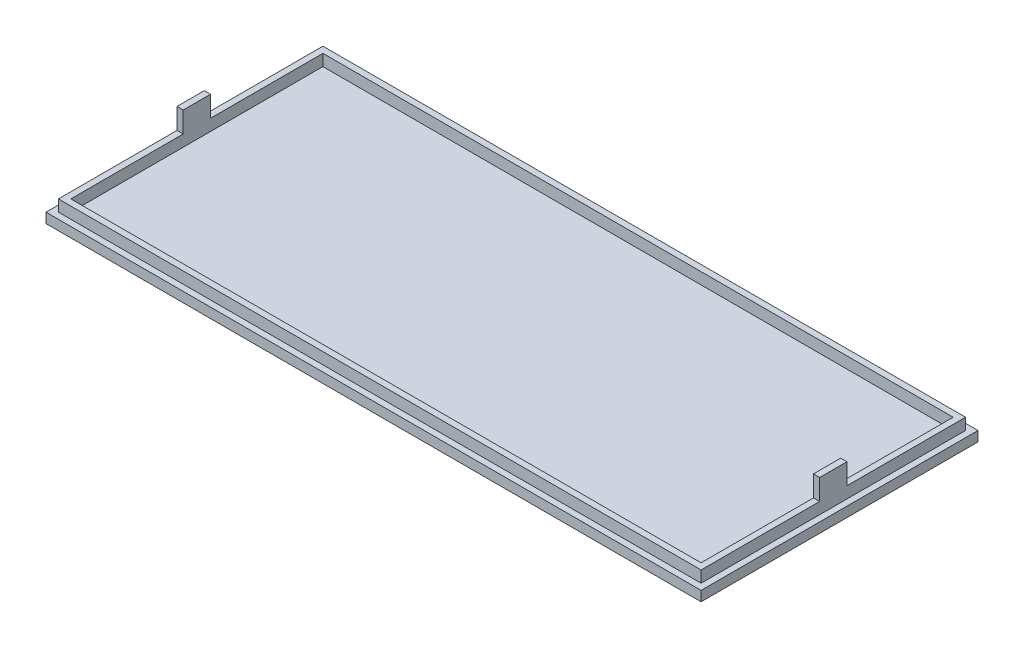
ISO-10303-21;
HEADER;
FILE_DESCRIPTION(('STEP AP214'),'2;1');
FILE_NAME('part.step','',(''),(''),'','','');
FILE_SCHEMA(('AUTOMOTIVE_DESIGN { 1 0 10303 214 1 1 1 1 }'));
ENDSEC;
DATA;
#1=APPLICATION_CONTEXT('core data for automotive mechanical design processes');
#2=APPLICATION_PROTOCOL_DEFINITION('international standard','automotive_design',2000,#1);
#3=PRODUCT_CONTEXT('',#1,'mechanical');
#4=PRODUCT('Part','Part','',(#3));
#5=PRODUCT_RELATED_PRODUCT_CATEGORY('part','',(#4));
#6=PRODUCT_DEFINITION_FORMATION('','',#4);
#7=PRODUCT_DEFINITION_CONTEXT('part definition',#1,'design');
#8=PRODUCT_DEFINITION('design','',#6,#7);
#9=PRODUCT_DEFINITION_SHAPE('','',#8);
#10=(LENGTH_UNIT() NAMED_UNIT(*) SI_UNIT(.MILLI.,.METRE.));
#11=(NAMED_UNIT(*) PLANE_ANGLE_UNIT() SI_UNIT($,.RADIAN.));
#12=(NAMED_UNIT(*) SI_UNIT($,.STERADIAN.) SOLID_ANGLE_UNIT());
#13=UNCERTAINTY_MEASURE_WITH_UNIT(LENGTH_MEASURE(1.E-05),#10,'distance_accuracy_value','');
#14=(GEOMETRIC_REPRESENTATION_CONTEXT(3) GLOBAL_UNCERTAINTY_ASSIGNED_CONTEXT((#13)) GLOBAL_UNIT_ASSIGNED_CONTEXT((#10,
#11,#12)) REPRESENTATION_CONTEXT('',''));
#15=CARTESIAN_POINT('',(0.,0.,0.));
#16=DIRECTION('',(0.,0.,1.));
#17=DIRECTION('',(1.,0.,0.));
#18=AXIS2_PLACEMENT_3D('',#15,#16,#17);
#19=CARTESIAN_POINT('',(0.,3.45,0.));
#20=DIRECTION('',(0.,1.,0.));
#21=DIRECTION('',(0.,0.,1.));
#22=AXIS2_PLACEMENT_3D('',#19,#20,#21);
#23=PLANE('',#22);
#24=DIRECTION('',(0.,0.,1.));
#25=VECTOR('',#24,1.);
#26=CARTESIAN_POINT('',(-26.9,3.45,0.));
#27=LINE('',#26,#25);
#28=CARTESIAN_POINT('',(-26.9,3.45,10.1454347826087));
#29=VERTEX_POINT('',#28);
#30=CARTESIAN_POINT('',(-26.9,3.45,28.2654347826087));
#31=VERTEX_POINT('',#30);
#32=EDGE_CURVE('E51',#29,#31,#27,.T.);
#33=ORIENTED_EDGE('',*,*,#32,.F.);
#34=DIRECTION('',(-1.,0.,0.));
#35=VECTOR('',#34,1.);
#36=CARTESIAN_POINT('',(0.,3.45,10.1454347826087));
#37=LINE('',#36,#35);
#38=CARTESIAN_POINT('',(-27.9,3.45,10.1454347826087));
#39=VERTEX_POINT('',#38);
#40=EDGE_CURVE('E200',#29,#39,#37,.T.);
#41=ORIENTED_EDGE('',*,*,#40,.T.);
#42=DIRECTION('',(0.,0.,1.));
#43=VECTOR('',#42,1.);
#44=CARTESIAN_POINT('',(-27.9,3.45,0.));
#45=LINE('',#44,#43);
#46=CARTESIAN_POINT('',(-27.9,3.45,29.2654347826087));
#47=VERTEX_POINT('',#46);
#48=EDGE_CURVE('E198',#39,#47,#45,.T.);
#49=ORIENTED_EDGE('',*,*,#48,.T.);
#50=DIRECTION('',(1.,0.,0.));
#51=VECTOR('',#50,1.);
#52=CARTESIAN_POINT('',(0.,3.45,29.2654347826087));
#53=LINE('',#52,#51);
#54=CARTESIAN_POINT('',(75.7,3.45,29.2654347826087));
#55=VERTEX_POINT('',#54);
#56=EDGE_CURVE('E230',#47,#55,#53,.T.);
#57=ORIENTED_EDGE('',*,*,#56,.T.);
#58=DIRECTION('',(0.,0.,1.));
#59=VECTOR('',#58,1.);
#60=CARTESIAN_POINT('',(75.7,3.45,0.));
#61=LINE('',#60,#59);
#62=CARTESIAN_POINT('',(75.7,3.45,10.1454347826087));
#63=VERTEX_POINT('',#62);
#64=EDGE_CURVE('E233',#63,#55,#61,.T.);
#65=ORIENTED_EDGE('',*,*,#64,.F.);
#66=DIRECTION('',(-1.,0.,0.));
#67=VECTOR('',#66,1.);
#68=CARTESIAN_POINT('',(0.,3.45,10.1454347826087));
#69=LINE('',#68,#67);
#70=CARTESIAN_POINT('',(74.7,3.45,10.1454347826087));
#71=VERTEX_POINT('',#70);
#72=EDGE_CURVE('E11',#63,#71,#69,.T.);
#73=ORIENTED_EDGE('',*,*,#72,.T.);
#74=DIRECTION('',(0.,0.,1.));
#75=VECTOR('',#74,1.);
#76=CARTESIAN_POINT('',(74.7,3.45,0.));
#77=LINE('',#76,#75);
#78=CARTESIAN_POINT('',(74.7,3.45,28.2654347826087));
#79=VERTEX_POINT('',#78);
#80=EDGE_CURVE('E242',#71,#79,#77,.T.);
#81=ORIENTED_EDGE('',*,*,#80,.T.);
#82=DIRECTION('',(1.,0.,0.));
#83=VECTOR('',#82,1.);
#84=CARTESIAN_POINT('',(0.,3.45,28.2654347826087));
#85=LINE('',#84,#83);
#86=EDGE_CURVE('E245',#31,#79,#85,.T.);
#87=ORIENTED_EDGE('',*,*,#86,.F.);
#88=EDGE_LOOP('',(#33,#41,#49,#57,#65,#73,#81,#87));
#89=FACE_BOUND('',#88,.T.);
#90=ADVANCED_FACE('F36',(#89),#23,.T.);
#91=DIRECTION('',(-1.,0.,0.));
#92=VECTOR('',#91,1.);
#93=CARTESIAN_POINT('',(0.,3.45,5.74543478260869));
#94=LINE('',#93,#92);
#95=CARTESIAN_POINT('',(-26.9,3.45,5.74543478260869));
#96=VERTEX_POINT('',#95);
#97=CARTESIAN_POINT('',(-27.9,3.45,5.74543478260869));
#98=VERTEX_POINT('',#97);
#99=EDGE_CURVE('E59',#96,#98,#94,.T.);
#100=ORIENTED_EDGE('',*,*,#99,.F.);
#101=CARTESIAN_POINT('',(-26.9,3.45,-12.3745652173913));
#102=VERTEX_POINT('',#101);
#103=EDGE_CURVE('E248',#102,#96,#27,.T.);
#104=ORIENTED_EDGE('',*,*,#103,.F.);
#105=DIRECTION('',(1.,0.,0.));
#106=VECTOR('',#105,1.);
#107=CARTESIAN_POINT('',(0.,3.45,-12.3745652173913));
#108=LINE('',#107,#106);
#109=CARTESIAN_POINT('',(74.7,3.45,-12.3745652173913));
#110=VERTEX_POINT('',#109);
#111=EDGE_CURVE('E250',#102,#110,#108,.T.);
#112=ORIENTED_EDGE('',*,*,#111,.T.);
#113=CARTESIAN_POINT('',(74.7,3.45,5.74543478260869));
#114=VERTEX_POINT('',#113);
#115=EDGE_CURVE('E243',#110,#114,#77,.T.);
#116=ORIENTED_EDGE('',*,*,#115,.T.);
#117=DIRECTION('',(-1.,0.,0.));
#118=VECTOR('',#117,1.);
#119=CARTESIAN_POINT('',(0.,3.45,5.74543478260869));
#120=LINE('',#119,#118);
#121=CARTESIAN_POINT('',(75.7,3.45,5.74543478260869));
#122=VERTEX_POINT('',#121);
#123=EDGE_CURVE('E44',#122,#114,#120,.T.);
#124=ORIENTED_EDGE('',*,*,#123,.F.);
#125=CARTESIAN_POINT('',(75.7,3.45,-13.3745652173913));
#126=VERTEX_POINT('',#125);
#127=EDGE_CURVE('E234',#126,#122,#61,.T.);
#128=ORIENTED_EDGE('',*,*,#127,.F.);
#129=DIRECTION('',(1.,0.,0.));
#130=VECTOR('',#129,1.);
#131=CARTESIAN_POINT('',(0.,3.45,-13.3745652173913));
#132=LINE('',#131,#130);
#133=CARTESIAN_POINT('',(-27.9,3.45,-13.3745652173913));
#134=VERTEX_POINT('',#133);
#135=EDGE_CURVE('E237',#134,#126,#132,.T.);
#136=ORIENTED_EDGE('',*,*,#135,.F.);
#137=EDGE_CURVE('E240',#134,#98,#45,.T.);
#138=ORIENTED_EDGE('',*,*,#137,.T.);
#139=EDGE_LOOP('',(#100,#104,#112,#116,#124,#128,#136,#138));
#140=FACE_BOUND('',#139,.T.);
#141=ADVANCED_FACE('F341',(#140),#23,.T.);
#142=CARTESIAN_POINT('',(0.,1.6,0.));
#143=DIRECTION('',(0.,1.,0.));
#144=DIRECTION('',(0.,0.,1.));
#145=AXIS2_PLACEMENT_3D('',#142,#143,#144);
#146=PLANE('',#145);
#147=DIRECTION('',(0.,0.,1.));
#148=VECTOR('',#147,1.);
#149=CARTESIAN_POINT('',(76.7,1.6,0.));
#150=LINE('',#149,#148);
#151=CARTESIAN_POINT('',(76.7,1.6,-14.3745652173913));
#152=VERTEX_POINT('',#151);
#153=CARTESIAN_POINT('',(76.7,1.6,30.2654347826087));
#154=VERTEX_POINT('',#153);
#155=EDGE_CURVE('E295',#152,#154,#150,.T.);
#156=ORIENTED_EDGE('',*,*,#155,.F.);
#157=DIRECTION('',(1.,0.,0.));
#158=VECTOR('',#157,1.);
#159=CARTESIAN_POINT('',(0.,1.6,-14.3745652173913));
#160=LINE('',#159,#158);
#161=CARTESIAN_POINT('',(-28.9,1.6,-14.3745652173913));
#162=VERTEX_POINT('',#161);
#163=EDGE_CURVE('E298',#162,#152,#160,.T.);
#164=ORIENTED_EDGE('',*,*,#163,.F.);
#165=DIRECTION('',(0.,0.,1.));
#166=VECTOR('',#165,1.);
#167=CARTESIAN_POINT('',(-28.9,1.6,0.));
#168=LINE('',#167,#166);
#169=CARTESIAN_POINT('',(-28.9,1.6,30.2654347826087));
#170=VERTEX_POINT('',#169);
#171=EDGE_CURVE('E302',#162,#170,#168,.T.);
#172=ORIENTED_EDGE('',*,*,#171,.T.);
#173=DIRECTION('',(1.,0.,0.));
#174=VECTOR('',#173,1.);
#175=CARTESIAN_POINT('',(0.,1.6,30.2654347826087));
#176=LINE('',#175,#174);
#177=EDGE_CURVE('E304',#170,#154,#176,.T.);
#178=ORIENTED_EDGE('',*,*,#177,.T.);
#179=EDGE_LOOP('',(#156,#164,#172,#178));
#180=FACE_BOUND('',#179,.T.);
#181=DIRECTION('',(0.,0.,-1.));
#182=VECTOR('',#181,1.);
#183=CARTESIAN_POINT('',(75.7,1.6,0.));
#184=LINE('',#183,#182);
#185=CARTESIAN_POINT('',(75.7,1.6,29.2654347826087));
#186=VERTEX_POINT('',#185);
#187=CARTESIAN_POINT('',(75.7,1.6,-13.3745652173913));
#188=VERTEX_POINT('',#187);
#189=EDGE_CURVE('E283',#186,#188,#184,.T.);
#190=ORIENTED_EDGE('',*,*,#189,.F.);
#191=DIRECTION('',(-1.,0.,0.));
#192=VECTOR('',#191,1.);
#193=CARTESIAN_POINT('',(0.,1.6,29.2654347826087));
#194=LINE('',#193,#192);
#195=CARTESIAN_POINT('',(-27.9,1.6,29.2654347826087));
#196=VERTEX_POINT('',#195);
#197=EDGE_CURVE('E285',#186,#196,#194,.T.);
#198=ORIENTED_EDGE('',*,*,#197,.T.);
#199=DIRECTION('',(0.,0.,-1.));
#200=VECTOR('',#199,1.);
#201=CARTESIAN_POINT('',(-27.9,1.6,0.));
#202=LINE('',#201,#200);
#203=CARTESIAN_POINT('',(-27.9,1.6,-13.3745652173913));
#204=VERTEX_POINT('',#203);
#205=EDGE_CURVE('E278',#196,#204,#202,.T.);
#206=ORIENTED_EDGE('',*,*,#205,.T.);
#207=DIRECTION('',(-1.,0.,0.));
#208=VECTOR('',#207,1.);
#209=CARTESIAN_POINT('',(0.,1.6,-13.3745652173913));
#210=LINE('',#209,#208);
#211=EDGE_CURVE('E280',#188,#204,#210,.T.);
#212=ORIENTED_EDGE('',*,*,#211,.F.);
#213=EDGE_LOOP('',(#190,#198,#206,#212));
#214=FACE_BOUND('',#213,.T.);
#215=ADVANCED_FACE('F377',(#180,#214),#146,.T.);
#216=CARTESIAN_POINT('',(76.7,1.6,0.));
#217=DIRECTION('',(1.,0.,0.));
#218=DIRECTION('',(0.,0.,-1.));
#219=AXIS2_PLACEMENT_3D('',#216,#217,#218);
#220=PLANE('',#219);
#221=DIRECTION('',(0.,0.,1.));
#222=VECTOR('',#221,1.);
#223=CARTESIAN_POINT('',(76.7,0.,0.));
#224=LINE('',#223,#222);
#225=CARTESIAN_POINT('',(76.7,0.,-14.3745652173913));
#226=VERTEX_POINT('',#225);
#227=CARTESIAN_POINT('',(76.7,0.,30.2654347826087));
#228=VERTEX_POINT('',#227);
#229=EDGE_CURVE('E294',#226,#228,#224,.T.);
#230=ORIENTED_EDGE('',*,*,#229,.F.);
#231=DIRECTION('',(0.,-1.,0.));
#232=VECTOR('',#231,1.);
#233=CARTESIAN_POINT('',(76.7,1.6,-14.3745652173913));
#234=LINE('',#233,#232);
#235=EDGE_CURVE('E322',#152,#226,#234,.T.);
#236=ORIENTED_EDGE('',*,*,#235,.F.);
#237=ORIENTED_EDGE('',*,*,#155,.T.);
#238=DIRECTION('',(0.,-1.,0.));
#239=VECTOR('',#238,1.);
#240=CARTESIAN_POINT('',(76.7,1.6,30.2654347826087));
#241=LINE('',#240,#239);
#242=EDGE_CURVE('E306',#154,#228,#241,.T.);
#243=ORIENTED_EDGE('',*,*,#242,.T.);
#244=EDGE_LOOP('',(#230,#236,#237,#243));
#245=FACE_BOUND('',#244,.T.);
#246=ADVANCED_FACE('F38',(#245),#220,.T.);
#247=CARTESIAN_POINT('',(0.,1.6,-14.3745652173913));
#248=DIRECTION('',(0.,0.,-1.));
#249=DIRECTION('',(-1.,0.,0.));
#250=AXIS2_PLACEMENT_3D('',#247,#248,#249);
#251=PLANE('',#250);
#252=DIRECTION('',(1.,0.,0.));
#253=VECTOR('',#252,1.);
#254=CARTESIAN_POINT('',(0.,0.,-14.3745652173913));
#255=LINE('',#254,#253);
#256=CARTESIAN_POINT('',(-28.9,0.,-14.3745652173913));
#257=VERTEX_POINT('',#256);
#258=EDGE_CURVE('E309',#257,#226,#255,.T.);
#259=ORIENTED_EDGE('',*,*,#258,.F.);
#260=DIRECTION('',(0.,-1.,0.));
#261=VECTOR('',#260,1.);
#262=CARTESIAN_POINT('',(-28.9,1.6,-14.3745652173913));
#263=LINE('',#262,#261);
#264=EDGE_CURVE('E320',#162,#257,#263,.T.);
#265=ORIENTED_EDGE('',*,*,#264,.F.);
#266=ORIENTED_EDGE('',*,*,#163,.T.);
#267=ORIENTED_EDGE('',*,*,#235,.T.);
#268=EDGE_LOOP('',(#259,#265,#266,#267));
#269=FACE_BOUND('',#268,.T.);
#270=ADVANCED_FACE('F540',(#269),#251,.T.);
#271=CARTESIAN_POINT('',(-28.9,1.6,0.));
#272=DIRECTION('',(1.,0.,0.));
#273=DIRECTION('',(0.,0.,-1.));
#274=AXIS2_PLACEMENT_3D('',#271,#272,#273);
#275=PLANE('',#274);
#276=DIRECTION('',(0.,0.,1.));
#277=VECTOR('',#276,1.);
#278=CARTESIAN_POINT('',(-28.9,0.,0.));
#279=LINE('',#278,#277);
#280=CARTESIAN_POINT('',(-28.9,0.,30.2654347826087));
#281=VERTEX_POINT('',#280);
#282=EDGE_CURVE('E312',#257,#281,#279,.T.);
#283=ORIENTED_EDGE('',*,*,#282,.T.);
#284=DIRECTION('',(0.,-1.,0.));
#285=VECTOR('',#284,1.);
#286=CARTESIAN_POINT('',(-28.9,1.6,30.2654347826087));
#287=LINE('',#286,#285);
#288=EDGE_CURVE('E317',#170,#281,#287,.T.);
#289=ORIENTED_EDGE('',*,*,#288,.F.);
#290=ORIENTED_EDGE('',*,*,#171,.F.);
#291=ORIENTED_EDGE('',*,*,#264,.T.);
#292=EDGE_LOOP('',(#283,#289,#290,#291));
#293=FACE_BOUND('',#292,.T.);
#294=ADVANCED_FACE('F530',(#293),#275,.F.);
#295=CARTESIAN_POINT('',(0.,1.6,30.2654347826087));
#296=DIRECTION('',(0.,0.,-1.));
#297=DIRECTION('',(-1.,0.,0.));
#298=AXIS2_PLACEMENT_3D('',#295,#296,#297);
#299=PLANE('',#298);
#300=DIRECTION('',(1.,0.,0.));
#301=VECTOR('',#300,1.);
#302=CARTESIAN_POINT('',(0.,0.,30.2654347826087));
#303=LINE('',#302,#301);
#304=EDGE_CURVE('E299',#281,#228,#303,.T.);
#305=ORIENTED_EDGE('',*,*,#304,.T.);
#306=ORIENTED_EDGE('',*,*,#242,.F.);
#307=ORIENTED_EDGE('',*,*,#177,.F.);
#308=ORIENTED_EDGE('',*,*,#288,.T.);
#309=EDGE_LOOP('',(#305,#306,#307,#308));
#310=FACE_BOUND('',#309,.T.);
#311=ADVANCED_FACE('F473',(#310),#299,.F.);
#312=CARTESIAN_POINT('',(0.,0.,0.));
#313=DIRECTION('',(0.,1.,0.));
#314=DIRECTION('',(0.,0.,1.));
#315=AXIS2_PLACEMENT_3D('',#312,#313,#314);
#316=PLANE('',#315);
#317=ORIENTED_EDGE('',*,*,#229,.T.);
#318=ORIENTED_EDGE('',*,*,#304,.F.);
#319=ORIENTED_EDGE('',*,*,#282,.F.);
#320=ORIENTED_EDGE('',*,*,#258,.T.);
#321=EDGE_LOOP('',(#317,#318,#319,#320));
#322=FACE_BOUND('',#321,.T.);
#323=ADVANCED_FACE('F463',(#322),#316,.F.);
#324=CARTESIAN_POINT('',(74.7,3.45,0.));
#325=DIRECTION('',(1.,0.,0.));
#326=DIRECTION('',(0.,0.,-1.));
#327=AXIS2_PLACEMENT_3D('',#324,#325,#326);
#328=PLANE('',#327);
#329=DIRECTION('',(0.,-1.,0.));
#330=VECTOR('',#329,1.);
#331=CARTESIAN_POINT('',(74.7,3.45,-12.3745652173913));
#332=LINE('',#331,#330);
#333=CARTESIAN_POINT('',(74.7,1.6,-12.3745652173913));
#334=VERTEX_POINT('',#333);
#335=EDGE_CURVE('E253',#110,#334,#332,.T.);
#336=ORIENTED_EDGE('',*,*,#335,.T.);
#337=DIRECTION('',(0.,0.,-1.));
#338=VECTOR('',#337,1.);
#339=CARTESIAN_POINT('',(74.7,1.6,0.));
#340=LINE('',#339,#338);
#341=CARTESIAN_POINT('',(74.7,1.6,28.2654347826087));
#342=VERTEX_POINT('',#341);
#343=EDGE_CURVE('E292',#342,#334,#340,.T.);
#344=ORIENTED_EDGE('',*,*,#343,.F.);
#345=DIRECTION('',(0.,-1.,0.));
#346=VECTOR('',#345,1.);
#347=CARTESIAN_POINT('',(74.7,3.45,28.2654347826087));
#348=LINE('',#347,#346);
#349=EDGE_CURVE('E263',#79,#342,#348,.T.);
#350=ORIENTED_EDGE('',*,*,#349,.F.);
#351=ORIENTED_EDGE('',*,*,#80,.F.);
#352=DIRECTION('',(0.,-1.,0.));
#353=VECTOR('',#352,1.);
#354=CARTESIAN_POINT('',(74.7,6.8,10.1454347826087));
#355=LINE('',#354,#353);
#356=CARTESIAN_POINT('',(74.7,6.8,10.1454347826087));
#357=VERTEX_POINT('',#356);
#358=EDGE_CURVE('E227',#357,#71,#355,.T.);
#359=ORIENTED_EDGE('',*,*,#358,.F.);
#360=DIRECTION('',(0.,0.,1.));
#361=VECTOR('',#360,1.);
#362=CARTESIAN_POINT('',(74.7,6.8,0.));
#363=LINE('',#362,#361);
#364=CARTESIAN_POINT('',(74.7,6.8,5.74543478260869));
#365=VERTEX_POINT('',#364);
#366=EDGE_CURVE('E207',#365,#357,#363,.T.);
#367=ORIENTED_EDGE('',*,*,#366,.F.);
#368=DIRECTION('',(0.,-1.,0.));
#369=VECTOR('',#368,1.);
#370=CARTESIAN_POINT('',(74.7,6.8,5.74543478260869));
#371=LINE('',#370,#369);
#372=EDGE_CURVE('E218',#365,#114,#371,.T.);
#373=ORIENTED_EDGE('',*,*,#372,.T.);
#374=ORIENTED_EDGE('',*,*,#115,.F.);
#375=EDGE_LOOP('',(#336,#344,#350,#351,#359,#367,#373,#374));
#376=FACE_BOUND('',#375,.T.);
#377=ADVANCED_FACE('F330',(#376),#328,.F.);
#378=CARTESIAN_POINT('',(0.,3.45,28.2654347826087));
#379=DIRECTION('',(0.,0.,-1.));
#380=DIRECTION('',(-1.,0.,0.));
#381=AXIS2_PLACEMENT_3D('',#378,#379,#380);
#382=PLANE('',#381);
#383=ORIENTED_EDGE('',*,*,#349,.T.);
#384=DIRECTION('',(-1.,0.,0.));
#385=VECTOR('',#384,1.);
#386=CARTESIAN_POINT('',(0.,1.6,28.2654347826087));
#387=LINE('',#386,#385);
#388=CARTESIAN_POINT('',(-26.9,1.6,28.2654347826087));
#389=VERTEX_POINT('',#388);
#390=EDGE_CURVE('E290',#342,#389,#387,.T.);
#391=ORIENTED_EDGE('',*,*,#390,.T.);
#392=DIRECTION('',(0.,-1.,0.));
#393=VECTOR('',#392,1.);
#394=CARTESIAN_POINT('',(-26.9,3.45,28.2654347826087));
#395=LINE('',#394,#393);
#396=EDGE_CURVE('E260',#31,#389,#395,.T.);
#397=ORIENTED_EDGE('',*,*,#396,.F.);
#398=ORIENTED_EDGE('',*,*,#86,.T.);
#399=EDGE_LOOP('',(#383,#391,#397,#398));
#400=FACE_BOUND('',#399,.T.);
#401=ADVANCED_FACE('F358',(#400),#382,.T.);
#402=CARTESIAN_POINT('',(-26.9,3.45,0.));
#403=DIRECTION('',(1.,0.,0.));
#404=DIRECTION('',(0.,0.,-1.));
#405=AXIS2_PLACEMENT_3D('',#402,#403,#404);
#406=PLANE('',#405);
#407=ORIENTED_EDGE('',*,*,#103,.T.);
#408=DIRECTION('',(0.,-1.,0.));
#409=VECTOR('',#408,1.);
#410=CARTESIAN_POINT('',(-26.9,6.8,5.74543478260869));
#411=LINE('',#410,#409);
#412=CARTESIAN_POINT('',(-26.9,6.8,5.74543478260869));
#413=VERTEX_POINT('',#412);
#414=EDGE_CURVE('E202',#413,#96,#411,.T.);
#415=ORIENTED_EDGE('',*,*,#414,.F.);
#416=DIRECTION('',(0.,0.,1.));
#417=VECTOR('',#416,1.);
#418=CARTESIAN_POINT('',(-26.9,6.8,0.));
#419=LINE('',#418,#417);
#420=CARTESIAN_POINT('',(-26.9,6.8,10.1454347826087));
#421=VERTEX_POINT('',#420);
#422=EDGE_CURVE('E183',#413,#421,#419,.T.);
#423=ORIENTED_EDGE('',*,*,#422,.T.);
#424=DIRECTION('',(0.,-1.,0.));
#425=VECTOR('',#424,1.);
#426=CARTESIAN_POINT('',(-26.9,6.8,10.1454347826087));
#427=LINE('',#426,#425);
#428=EDGE_CURVE('E179',#421,#29,#427,.T.);
#429=ORIENTED_EDGE('',*,*,#428,.T.);
#430=ORIENTED_EDGE('',*,*,#32,.T.);
#431=ORIENTED_EDGE('',*,*,#396,.T.);
#432=DIRECTION('',(0.,0.,-1.));
#433=VECTOR('',#432,1.);
#434=CARTESIAN_POINT('',(-26.9,1.6,0.));
#435=LINE('',#434,#433);
#436=CARTESIAN_POINT('',(-26.9,1.6,-12.3745652173913));
#437=VERTEX_POINT('',#436);
#438=EDGE_CURVE('E288',#389,#437,#435,.T.);
#439=ORIENTED_EDGE('',*,*,#438,.T.);
#440=DIRECTION('',(0.,-1.,0.));
#441=VECTOR('',#440,1.);
#442=CARTESIAN_POINT('',(-26.9,3.45,-12.3745652173913));
#443=LINE('',#442,#441);
#444=EDGE_CURVE('E256',#102,#437,#443,.T.);
#445=ORIENTED_EDGE('',*,*,#444,.F.);
#446=EDGE_LOOP('',(#407,#415,#423,#429,#430,#431,#439,#445));
#447=FACE_BOUND('',#446,.T.);
#448=ADVANCED_FACE('F354',(#447),#406,.T.);
#449=CARTESIAN_POINT('',(0.,3.45,29.2654347826087));
#450=DIRECTION('',(0.,0.,-1.));
#451=DIRECTION('',(-1.,0.,0.));
#452=AXIS2_PLACEMENT_3D('',#449,#450,#451);
#453=PLANE('',#452);
#454=ORIENTED_EDGE('',*,*,#197,.F.);
#455=DIRECTION('',(0.,-1.,0.));
#456=VECTOR('',#455,1.);
#457=CARTESIAN_POINT('',(75.7,3.45,29.2654347826087));
#458=LINE('',#457,#456);
#459=EDGE_CURVE('E257',#55,#186,#458,.T.);
#460=ORIENTED_EDGE('',*,*,#459,.F.);
#461=ORIENTED_EDGE('',*,*,#56,.F.);
#462=DIRECTION('',(0.,-1.,0.));
#463=VECTOR('',#462,1.);
#464=CARTESIAN_POINT('',(-27.9,3.45,29.2654347826087));
#465=LINE('',#464,#463);
#466=EDGE_CURVE('E252',#47,#196,#465,.T.);
#467=ORIENTED_EDGE('',*,*,#466,.T.);
#468=EDGE_LOOP('',(#454,#460,#461,#467));
#469=FACE_BOUND('',#468,.T.);
#470=ADVANCED_FACE('F443',(#469),#453,.F.);
#471=CARTESIAN_POINT('',(75.7,3.45,0.));
#472=DIRECTION('',(1.,0.,0.));
#473=DIRECTION('',(0.,0.,-1.));
#474=AXIS2_PLACEMENT_3D('',#471,#472,#473);
#475=PLANE('',#474);
#476=ORIENTED_EDGE('',*,*,#127,.T.);
#477=DIRECTION('',(0.,-1.,0.));
#478=VECTOR('',#477,1.);
#479=CARTESIAN_POINT('',(75.7,6.8,5.74543478260869));
#480=LINE('',#479,#478);
#481=CARTESIAN_POINT('',(75.7,6.8,5.74543478260869));
#482=VERTEX_POINT('',#481);
#483=EDGE_CURVE('E221',#482,#122,#480,.T.);
#484=ORIENTED_EDGE('',*,*,#483,.F.);
#485=DIRECTION('',(0.,0.,1.));
#486=VECTOR('',#485,1.);
#487=CARTESIAN_POINT('',(75.7,6.8,0.));
#488=LINE('',#487,#486);
#489=CARTESIAN_POINT('',(75.7,6.8,10.1454347826087));
#490=VERTEX_POINT('',#489);
#491=EDGE_CURVE('E212',#482,#490,#488,.T.);
#492=ORIENTED_EDGE('',*,*,#491,.T.);
#493=DIRECTION('',(0.,-1.,0.));
#494=VECTOR('',#493,1.);
#495=CARTESIAN_POINT('',(75.7,6.8,10.1454347826087));
#496=LINE('',#495,#494);
#497=EDGE_CURVE('E224',#490,#63,#496,.T.);
#498=ORIENTED_EDGE('',*,*,#497,.T.);
#499=ORIENTED_EDGE('',*,*,#64,.T.);
#500=ORIENTED_EDGE('',*,*,#459,.T.);
#501=ORIENTED_EDGE('',*,*,#189,.T.);
#502=DIRECTION('',(0.,-1.,0.));
#503=VECTOR('',#502,1.);
#504=CARTESIAN_POINT('',(75.7,3.45,-13.3745652173913));
#505=LINE('',#504,#503);
#506=EDGE_CURVE('E271',#126,#188,#505,.T.);
#507=ORIENTED_EDGE('',*,*,#506,.F.);
#508=EDGE_LOOP('',(#476,#484,#492,#498,#499,#500,#501,#507));
#509=FACE_BOUND('',#508,.T.);
#510=ADVANCED_FACE('F339',(#509),#475,.T.);
#511=CARTESIAN_POINT('',(0.,3.45,-13.3745652173913));
#512=DIRECTION('',(0.,0.,-1.));
#513=DIRECTION('',(-1.,0.,0.));
#514=AXIS2_PLACEMENT_3D('',#511,#512,#513);
#515=PLANE('',#514);
#516=ORIENTED_EDGE('',*,*,#506,.T.);
#517=ORIENTED_EDGE('',*,*,#211,.T.);
#518=DIRECTION('',(0.,-1.,0.));
#519=VECTOR('',#518,1.);
#520=CARTESIAN_POINT('',(-27.9,3.45,-13.3745652173913));
#521=LINE('',#520,#519);
#522=EDGE_CURVE('E269',#134,#204,#521,.T.);
#523=ORIENTED_EDGE('',*,*,#522,.F.);
#524=ORIENTED_EDGE('',*,*,#135,.T.);
#525=EDGE_LOOP('',(#516,#517,#523,#524));
#526=FACE_BOUND('',#525,.T.);
#527=ADVANCED_FACE('F343',(#526),#515,.T.);
#528=CARTESIAN_POINT('',(-27.9,3.45,0.));
#529=DIRECTION('',(1.,0.,0.));
#530=DIRECTION('',(0.,0.,-1.));
#531=AXIS2_PLACEMENT_3D('',#528,#529,#530);
#532=PLANE('',#531);
#533=ORIENTED_EDGE('',*,*,#522,.T.);
#534=ORIENTED_EDGE('',*,*,#205,.F.);
#535=ORIENTED_EDGE('',*,*,#466,.F.);
#536=ORIENTED_EDGE('',*,*,#48,.F.);
#537=DIRECTION('',(0.,-1.,0.));
#538=VECTOR('',#537,1.);
#539=CARTESIAN_POINT('',(-27.9,6.8,10.1454347826087));
#540=LINE('',#539,#538);
#541=CARTESIAN_POINT('',(-27.9,6.8,10.1454347826087));
#542=VERTEX_POINT('',#541);
#543=EDGE_CURVE('E177',#542,#39,#540,.T.);
#544=ORIENTED_EDGE('',*,*,#543,.F.);
#545=DIRECTION('',(0.,0.,1.));
#546=VECTOR('',#545,1.);
#547=CARTESIAN_POINT('',(-27.9,6.8,0.));
#548=LINE('',#547,#546);
#549=CARTESIAN_POINT('',(-27.9,6.8,5.74543478260869));
#550=VERTEX_POINT('',#549);
#551=EDGE_CURVE('E184',#550,#542,#548,.T.);
#552=ORIENTED_EDGE('',*,*,#551,.F.);
#553=DIRECTION('',(0.,-1.,0.));
#554=VECTOR('',#553,1.);
#555=CARTESIAN_POINT('',(-27.9,6.8,5.74543478260869));
#556=LINE('',#555,#554);
#557=EDGE_CURVE('E346',#550,#98,#556,.T.);
#558=ORIENTED_EDGE('',*,*,#557,.T.);
#559=ORIENTED_EDGE('',*,*,#137,.F.);
#560=EDGE_LOOP('',(#533,#534,#535,#536,#544,#552,#558,#559));
#561=FACE_BOUND('',#560,.T.);
#562=ADVANCED_FACE('F196',(#561),#532,.F.);
#563=CARTESIAN_POINT('',(0.,3.45,-12.3745652173913));
#564=DIRECTION('',(0.,0.,-1.));
#565=DIRECTION('',(-1.,0.,0.));
#566=AXIS2_PLACEMENT_3D('',#563,#564,#565);
#567=PLANE('',#566);
#568=DIRECTION('',(-1.,0.,0.));
#569=VECTOR('',#568,1.);
#570=CARTESIAN_POINT('',(0.,1.6,-12.3745652173913));
#571=LINE('',#570,#569);
#572=EDGE_CURVE('E266',#334,#437,#571,.T.);
#573=ORIENTED_EDGE('',*,*,#572,.F.);
#574=ORIENTED_EDGE('',*,*,#335,.F.);
#575=ORIENTED_EDGE('',*,*,#111,.F.);
#576=ORIENTED_EDGE('',*,*,#444,.T.);
#577=EDGE_LOOP('',(#573,#574,#575,#576));
#578=FACE_BOUND('',#577,.T.);
#579=ADVANCED_FACE('F367',(#578),#567,.F.);
#580=ORIENTED_EDGE('',*,*,#390,.F.);
#581=ORIENTED_EDGE('',*,*,#343,.T.);
#582=ORIENTED_EDGE('',*,*,#572,.T.);
#583=ORIENTED_EDGE('',*,*,#438,.F.);
#584=EDGE_LOOP('',(#580,#581,#582,#583));
#585=FACE_BOUND('',#584,.T.);
#586=ADVANCED_FACE('F363',(#585),#146,.T.);
#587=CARTESIAN_POINT('',(0.,6.8,10.1454347826087));
#588=DIRECTION('',(0.,0.,-1.));
#589=DIRECTION('',(-1.,0.,0.));
#590=AXIS2_PLACEMENT_3D('',#587,#588,#589);
#591=PLANE('',#590);
#592=ORIENTED_EDGE('',*,*,#72,.F.);
#593=ORIENTED_EDGE('',*,*,#497,.F.);
#594=DIRECTION('',(1.,0.,0.));
#595=VECTOR('',#594,1.);
#596=CARTESIAN_POINT('',(0.,6.8,10.1454347826087));
#597=LINE('',#596,#595);
#598=EDGE_CURVE('E210',#357,#490,#597,.T.);
#599=ORIENTED_EDGE('',*,*,#598,.F.);
#600=ORIENTED_EDGE('',*,*,#358,.T.);
#601=EDGE_LOOP('',(#592,#593,#599,#600));
#602=FACE_BOUND('',#601,.T.);
#603=ADVANCED_FACE('F375',(#602),#591,.F.);
#604=CARTESIAN_POINT('',(0.,6.8,5.74543478260869));
#605=DIRECTION('',(0.,0.,-1.));
#606=DIRECTION('',(-1.,0.,0.));
#607=AXIS2_PLACEMENT_3D('',#604,#605,#606);
#608=PLANE('',#607);
#609=ORIENTED_EDGE('',*,*,#483,.T.);
#610=ORIENTED_EDGE('',*,*,#123,.T.);
#611=ORIENTED_EDGE('',*,*,#372,.F.);
#612=DIRECTION('',(1.,0.,0.));
#613=VECTOR('',#612,1.);
#614=CARTESIAN_POINT('',(0.,6.8,5.74543478260869));
#615=LINE('',#614,#613);
#616=EDGE_CURVE('E215',#365,#482,#615,.T.);
#617=ORIENTED_EDGE('',*,*,#616,.T.);
#618=EDGE_LOOP('',(#609,#610,#611,#617));
#619=FACE_BOUND('',#618,.T.);
#620=ADVANCED_FACE('F325',(#619),#608,.T.);
#621=CARTESIAN_POINT('',(0.,6.8,0.));
#622=DIRECTION('',(0.,1.,0.));
#623=DIRECTION('',(0.,0.,1.));
#624=AXIS2_PLACEMENT_3D('',#621,#622,#623);
#625=PLANE('',#624);
#626=ORIENTED_EDGE('',*,*,#366,.T.);
#627=ORIENTED_EDGE('',*,*,#598,.T.);
#628=ORIENTED_EDGE('',*,*,#491,.F.);
#629=ORIENTED_EDGE('',*,*,#616,.F.);
#630=EDGE_LOOP('',(#626,#627,#628,#629));
#631=FACE_BOUND('',#630,.T.);
#632=ADVANCED_FACE('F336',(#631),#625,.T.);
#633=CARTESIAN_POINT('',(0.,6.8,10.1454347826087));
#634=DIRECTION('',(0.,0.,-1.));
#635=DIRECTION('',(-1.,0.,0.));
#636=AXIS2_PLACEMENT_3D('',#633,#634,#635);
#637=PLANE('',#636);
#638=ORIENTED_EDGE('',*,*,#40,.F.);
#639=ORIENTED_EDGE('',*,*,#428,.F.);
#640=DIRECTION('',(1.,0.,0.));
#641=VECTOR('',#640,1.);
#642=CARTESIAN_POINT('',(0.,6.8,10.1454347826087));
#643=LINE('',#642,#641);
#644=EDGE_CURVE('E173',#542,#421,#643,.T.);
#645=ORIENTED_EDGE('',*,*,#644,.F.);
#646=ORIENTED_EDGE('',*,*,#543,.T.);
#647=EDGE_LOOP('',(#638,#639,#645,#646));
#648=FACE_BOUND('',#647,.T.);
#649=ADVANCED_FACE('F175',(#648),#637,.F.);
#650=CARTESIAN_POINT('',(0.,6.8,5.74543478260869));
#651=DIRECTION('',(0.,0.,-1.));
#652=DIRECTION('',(-1.,0.,0.));
#653=AXIS2_PLACEMENT_3D('',#650,#651,#652);
#654=PLANE('',#653);
#655=ORIENTED_EDGE('',*,*,#414,.T.);
#656=ORIENTED_EDGE('',*,*,#99,.T.);
#657=ORIENTED_EDGE('',*,*,#557,.F.);
#658=DIRECTION('',(1.,0.,0.));
#659=VECTOR('',#658,1.);
#660=CARTESIAN_POINT('',(0.,6.8,5.74543478260869));
#661=LINE('',#660,#659);
#662=EDGE_CURVE('E190',#550,#413,#661,.T.);
#663=ORIENTED_EDGE('',*,*,#662,.T.);
#664=EDGE_LOOP('',(#655,#656,#657,#663));
#665=FACE_BOUND('',#664,.T.);
#666=ADVANCED_FACE('F349',(#665),#654,.T.);
#667=CARTESIAN_POINT('',(0.,6.8,0.));
#668=DIRECTION('',(0.,1.,0.));
#669=DIRECTION('',(0.,0.,1.));
#670=AXIS2_PLACEMENT_3D('',#667,#668,#669);
#671=PLANE('',#670);
#672=ORIENTED_EDGE('',*,*,#551,.T.);
#673=ORIENTED_EDGE('',*,*,#644,.T.);
#674=ORIENTED_EDGE('',*,*,#422,.F.);
#675=ORIENTED_EDGE('',*,*,#662,.F.);
#676=EDGE_LOOP('',(#672,#673,#674,#675));
#677=FACE_BOUND('',#676,.T.);
#678=ADVANCED_FACE('F188',(#677),#671,.T.);
#679=CLOSED_SHELL('',(#90,#141,#215,#246,#270,#294,#311,#323,#377,#401,#448,#470,#510,#527,#562,
#579,#586,#603,#620,#632,#649,#666,#678));
#680=MANIFOLD_SOLID_BREP('B2',#679);
#681=ADVANCED_BREP_SHAPE_REPRESENTATION('',(#18,#680),#14);
#682=SHAPE_DEFINITION_REPRESENTATION(#9,#681);
ENDSEC;
END-ISO-10303-21;
